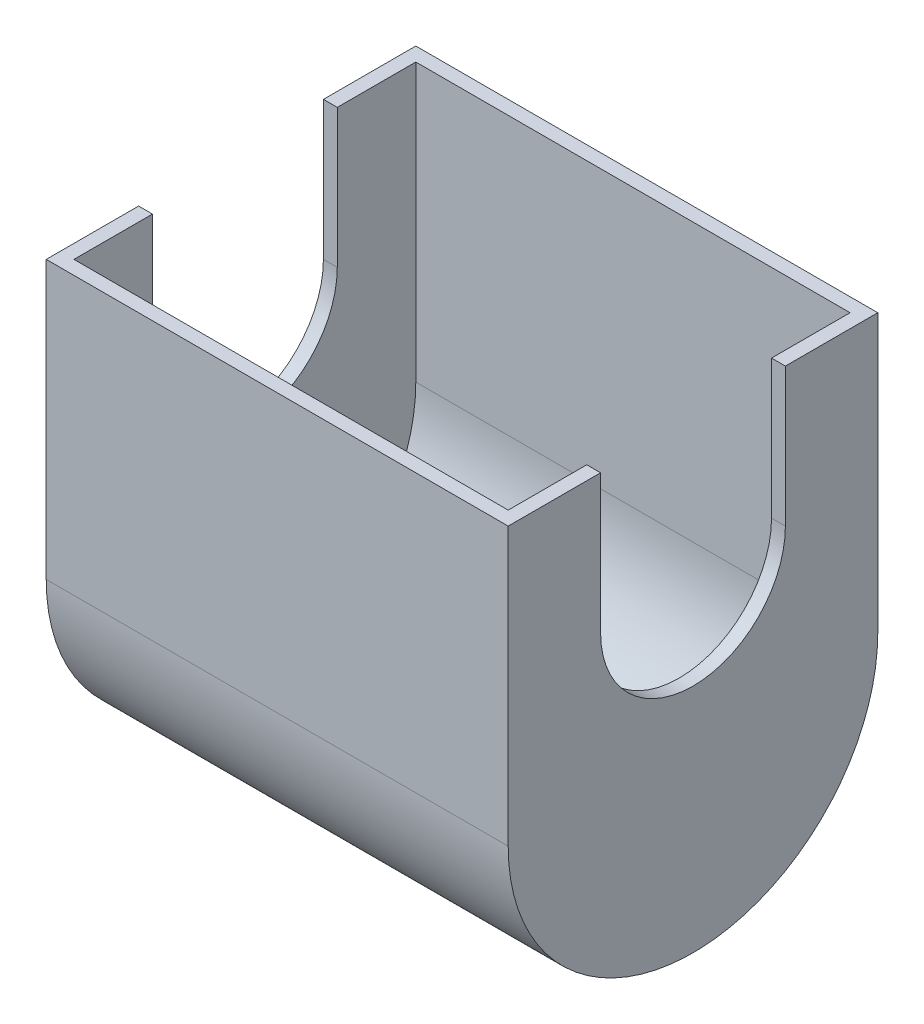
ISO-10303-21;
HEADER;
FILE_DESCRIPTION(('STEP AP214'),'2;1');
FILE_NAME('part.step','',(''),(''),'','','');
FILE_SCHEMA(('AUTOMOTIVE_DESIGN { 1 0 10303 214 1 1 1 1 }'));
ENDSEC;
DATA;
#1=APPLICATION_CONTEXT('core data for automotive mechanical design processes');
#2=APPLICATION_PROTOCOL_DEFINITION('international standard','automotive_design',2000,#1);
#3=PRODUCT_CONTEXT('',#1,'mechanical');
#4=PRODUCT('Part','Part','',(#3));
#5=PRODUCT_RELATED_PRODUCT_CATEGORY('part','',(#4));
#6=PRODUCT_DEFINITION_FORMATION('','',#4);
#7=PRODUCT_DEFINITION_CONTEXT('part definition',#1,'design');
#8=PRODUCT_DEFINITION('design','',#6,#7);
#9=PRODUCT_DEFINITION_SHAPE('','',#8);
#10=(LENGTH_UNIT() NAMED_UNIT(*) SI_UNIT(.MILLI.,.METRE.));
#11=(NAMED_UNIT(*) PLANE_ANGLE_UNIT() SI_UNIT($,.RADIAN.));
#12=(NAMED_UNIT(*) SI_UNIT($,.STERADIAN.) SOLID_ANGLE_UNIT());
#13=UNCERTAINTY_MEASURE_WITH_UNIT(LENGTH_MEASURE(1.E-05),#10,'distance_accuracy_value','');
#14=(GEOMETRIC_REPRESENTATION_CONTEXT(3) GLOBAL_UNCERTAINTY_ASSIGNED_CONTEXT((#13)) GLOBAL_UNIT_ASSIGNED_CONTEXT((#10,
#11,#12)) REPRESENTATION_CONTEXT('',''));
#15=CARTESIAN_POINT('',(0.,0.,0.));
#16=DIRECTION('',(0.,0.,1.));
#17=DIRECTION('',(1.,0.,0.));
#18=AXIS2_PLACEMENT_3D('',#15,#16,#17);
#19=CARTESIAN_POINT('',(100.,0.,40.));
#20=DIRECTION('',(0.,1.,0.));
#21=DIRECTION('',(0.,0.,1.));
#22=AXIS2_PLACEMENT_3D('',#19,#20,#21);
#23=PLANE('',#22);
#24=DIRECTION('',(-1.,0.,0.));
#25=VECTOR('',#24,1.);
#26=CARTESIAN_POINT('',(100.,0.,37.));
#27=LINE('',#26,#25);
#28=CARTESIAN_POINT('',(97.,0.,37.));
#29=VERTEX_POINT('',#28);
#30=CARTESIAN_POINT('',(3.,0.,37.));
#31=VERTEX_POINT('',#30);
#32=EDGE_CURVE('E153',#29,#31,#27,.T.);
#33=ORIENTED_EDGE('',*,*,#32,.T.);
#34=DIRECTION('',(0.,0.,-1.));
#35=VECTOR('',#34,1.);
#36=CARTESIAN_POINT('',(3.,0.,40.));
#37=LINE('',#36,#35);
#38=CARTESIAN_POINT('',(3.,0.,20.));
#39=VERTEX_POINT('',#38);
#40=EDGE_CURVE('E194',#31,#39,#37,.T.);
#41=ORIENTED_EDGE('',*,*,#40,.T.);
#42=DIRECTION('',(-1.,0.,0.));
#43=VECTOR('',#42,1.);
#44=CARTESIAN_POINT('',(100.,0.,20.));
#45=LINE('',#44,#43);
#46=CARTESIAN_POINT('',(0.,0.,20.));
#47=VERTEX_POINT('',#46);
#48=EDGE_CURVE('E148',#39,#47,#45,.T.);
#49=ORIENTED_EDGE('',*,*,#48,.T.);
#50=DIRECTION('',(0.,0.,-1.));
#51=VECTOR('',#50,1.);
#52=CARTESIAN_POINT('',(0.,0.,40.));
#53=LINE('',#52,#51);
#54=CARTESIAN_POINT('',(0.,0.,40.));
#55=VERTEX_POINT('',#54);
#56=EDGE_CURVE('E149',#55,#47,#53,.T.);
#57=ORIENTED_EDGE('',*,*,#56,.F.);
#58=DIRECTION('',(-1.,0.,0.));
#59=VECTOR('',#58,1.);
#60=CARTESIAN_POINT('',(100.,0.,40.));
#61=LINE('',#60,#59);
#62=CARTESIAN_POINT('',(100.,0.,40.));
#63=VERTEX_POINT('',#62);
#64=EDGE_CURVE('E11',#63,#55,#61,.T.);
#65=ORIENTED_EDGE('',*,*,#64,.F.);
#66=DIRECTION('',(0.,0.,-1.));
#67=VECTOR('',#66,1.);
#68=CARTESIAN_POINT('',(100.,0.,40.));
#69=LINE('',#68,#67);
#70=CARTESIAN_POINT('',(100.,0.,20.));
#71=VERTEX_POINT('',#70);
#72=EDGE_CURVE('E169',#63,#71,#69,.T.);
#73=ORIENTED_EDGE('',*,*,#72,.T.);
#74=CARTESIAN_POINT('',(97.,0.,20.));
#75=VERTEX_POINT('',#74);
#76=EDGE_CURVE('E40',#71,#75,#45,.T.);
#77=ORIENTED_EDGE('',*,*,#76,.T.);
#78=DIRECTION('',(0.,0.,-1.));
#79=VECTOR('',#78,1.);
#80=CARTESIAN_POINT('',(97.,0.,40.));
#81=LINE('',#80,#79);
#82=EDGE_CURVE('E53',#29,#75,#81,.T.);
#83=ORIENTED_EDGE('',*,*,#82,.F.);
#84=EDGE_LOOP('',(#33,#41,#49,#57,#65,#73,#77,#83));
#85=FACE_BOUND('',#84,.T.);
#86=ADVANCED_FACE('F37',(#85),#23,.T.);
#87=CARTESIAN_POINT('',(100.,0.,-20.));
#88=DIRECTION('',(0.,1.,0.));
#89=DIRECTION('',(0.,0.,1.));
#90=AXIS2_PLACEMENT_3D('',#87,#88,#89);
#91=PLANE('',#90);
#92=DIRECTION('',(-1.,0.,0.));
#93=VECTOR('',#92,1.);
#94=CARTESIAN_POINT('',(100.,0.,-20.));
#95=LINE('',#94,#93);
#96=CARTESIAN_POINT('',(3.,0.,-20.));
#97=VERTEX_POINT('',#96);
#98=CARTESIAN_POINT('',(0.,0.,-20.));
#99=VERTEX_POINT('',#98);
#100=EDGE_CURVE('E176',#97,#99,#95,.T.);
#101=ORIENTED_EDGE('',*,*,#100,.F.);
#102=DIRECTION('',(0.,0.,-1.));
#103=VECTOR('',#102,1.);
#104=CARTESIAN_POINT('',(3.,0.,-20.));
#105=LINE('',#104,#103);
#106=CARTESIAN_POINT('',(3.,0.,-37.));
#107=VERTEX_POINT('',#106);
#108=EDGE_CURVE('E237',#97,#107,#105,.T.);
#109=ORIENTED_EDGE('',*,*,#108,.T.);
#110=DIRECTION('',(-1.,0.,0.));
#111=VECTOR('',#110,1.);
#112=CARTESIAN_POINT('',(100.,0.,-37.));
#113=LINE('',#112,#111);
#114=CARTESIAN_POINT('',(97.,0.,-37.));
#115=VERTEX_POINT('',#114);
#116=EDGE_CURVE('E232',#115,#107,#113,.T.);
#117=ORIENTED_EDGE('',*,*,#116,.F.);
#118=DIRECTION('',(0.,0.,-1.));
#119=VECTOR('',#118,1.);
#120=CARTESIAN_POINT('',(97.,0.,-20.));
#121=LINE('',#120,#119);
#122=CARTESIAN_POINT('',(97.,0.,-20.));
#123=VERTEX_POINT('',#122);
#124=EDGE_CURVE('E224',#123,#115,#121,.T.);
#125=ORIENTED_EDGE('',*,*,#124,.F.);
#126=CARTESIAN_POINT('',(100.,0.,-20.));
#127=VERTEX_POINT('',#126);
#128=EDGE_CURVE('E173',#127,#123,#95,.T.);
#129=ORIENTED_EDGE('',*,*,#128,.F.);
#130=DIRECTION('',(0.,0.,-1.));
#131=VECTOR('',#130,1.);
#132=CARTESIAN_POINT('',(100.,0.,-20.));
#133=LINE('',#132,#131);
#134=CARTESIAN_POINT('',(100.,0.,-40.));
#135=VERTEX_POINT('',#134);
#136=EDGE_CURVE('E141',#127,#135,#133,.T.);
#137=ORIENTED_EDGE('',*,*,#136,.T.);
#138=DIRECTION('',(-1.,0.,0.));
#139=VECTOR('',#138,1.);
#140=CARTESIAN_POINT('',(100.,0.,-40.));
#141=LINE('',#140,#139);
#142=CARTESIAN_POINT('',(0.,0.,-40.));
#143=VERTEX_POINT('',#142);
#144=EDGE_CURVE('E138',#135,#143,#141,.T.);
#145=ORIENTED_EDGE('',*,*,#144,.T.);
#146=DIRECTION('',(0.,0.,-1.));
#147=VECTOR('',#146,1.);
#148=CARTESIAN_POINT('',(0.,0.,-20.));
#149=LINE('',#148,#147);
#150=EDGE_CURVE('E162',#99,#143,#149,.T.);
#151=ORIENTED_EDGE('',*,*,#150,.F.);
#152=EDGE_LOOP('',(#101,#109,#117,#125,#129,#137,#145,#151));
#153=FACE_BOUND('',#152,.T.);
#154=ADVANCED_FACE('F261',(#153),#91,.T.);
#155=CARTESIAN_POINT('',(100.,0.,-20.));
#156=DIRECTION('',(0.,0.,-1.));
#157=DIRECTION('',(0.,1.,0.));
#158=AXIS2_PLACEMENT_3D('',#155,#156,#157);
#159=PLANE('',#158);
#160=DIRECTION('',(0.,-1.,0.));
#161=VECTOR('',#160,1.);
#162=CARTESIAN_POINT('',(3.,0.,-20.));
#163=LINE('',#162,#161);
#164=CARTESIAN_POINT('',(3.,-30.,-20.));
#165=VERTEX_POINT('',#164);
#166=EDGE_CURVE('E241',#97,#165,#163,.T.);
#167=ORIENTED_EDGE('',*,*,#166,.F.);
#168=ORIENTED_EDGE('',*,*,#100,.T.);
#169=DIRECTION('',(0.,-1.,0.));
#170=VECTOR('',#169,1.);
#171=CARTESIAN_POINT('',(0.,0.,-20.));
#172=LINE('',#171,#170);
#173=CARTESIAN_POINT('',(0.,-30.,-20.));
#174=VERTEX_POINT('',#173);
#175=EDGE_CURVE('E159',#99,#174,#172,.T.);
#176=ORIENTED_EDGE('',*,*,#175,.T.);
#177=DIRECTION('',(-1.,0.,0.));
#178=VECTOR('',#177,1.);
#179=CARTESIAN_POINT('',(100.,-30.,-20.));
#180=LINE('',#179,#178);
#181=EDGE_CURVE('E179',#165,#174,#180,.T.);
#182=ORIENTED_EDGE('',*,*,#181,.F.);
#183=EDGE_LOOP('',(#167,#168,#176,#182));
#184=FACE_BOUND('',#183,.T.);
#185=ADVANCED_FACE('F281',(#184),#159,.F.);
#186=CARTESIAN_POINT('',(100.,-30.,0.));
#187=DIRECTION('',(-1.,0.,0.));
#188=DIRECTION('',(0.,0.,1.));
#189=AXIS2_PLACEMENT_3D('',#186,#187,#188);
#190=CYLINDRICAL_SURFACE('',#189,20.);
#191=DIRECTION('',(-1.,0.,0.));
#192=VECTOR('',#191,1.);
#193=CARTESIAN_POINT('',(100.,-30.,20.));
#194=LINE('',#193,#192);
#195=CARTESIAN_POINT('',(3.,-30.,20.));
#196=VERTEX_POINT('',#195);
#197=CARTESIAN_POINT('',(0.,-30.,20.));
#198=VERTEX_POINT('',#197);
#199=EDGE_CURVE('E182',#196,#198,#194,.T.);
#200=ORIENTED_EDGE('',*,*,#199,.F.);
#201=CARTESIAN_POINT('',(3.,-30.,0.));
#202=DIRECTION('',(1.,0.,0.));
#203=DIRECTION('',(0.,0.,-1.));
#204=AXIS2_PLACEMENT_3D('',#201,#202,#203);
#205=CIRCLE('',#204,20.);
#206=EDGE_CURVE('E244',#196,#165,#205,.T.);
#207=ORIENTED_EDGE('',*,*,#206,.T.);
#208=ORIENTED_EDGE('',*,*,#181,.T.);
#209=CARTESIAN_POINT('',(0.,-30.,0.));
#210=DIRECTION('',(1.,0.,0.));
#211=DIRECTION('',(0.,0.,-1.));
#212=AXIS2_PLACEMENT_3D('',#209,#210,#211);
#213=CIRCLE('',#212,20.);
#214=EDGE_CURVE('E156',#198,#174,#213,.T.);
#215=ORIENTED_EDGE('',*,*,#214,.F.);
#216=EDGE_LOOP('',(#200,#207,#208,#215));
#217=FACE_BOUND('',#216,.T.);
#218=ADVANCED_FACE('F254',(#217),#190,.F.);
#219=CARTESIAN_POINT('',(100.,0.,20.));
#220=DIRECTION('',(0.,0.,-1.));
#221=DIRECTION('',(0.,1.,0.));
#222=AXIS2_PLACEMENT_3D('',#219,#220,#221);
#223=PLANE('',#222);
#224=ORIENTED_EDGE('',*,*,#48,.F.);
#225=DIRECTION('',(0.,-1.,0.));
#226=VECTOR('',#225,1.);
#227=CARTESIAN_POINT('',(3.,0.,20.));
#228=LINE('',#227,#226);
#229=EDGE_CURVE('E246',#39,#196,#228,.T.);
#230=ORIENTED_EDGE('',*,*,#229,.T.);
#231=ORIENTED_EDGE('',*,*,#199,.T.);
#232=DIRECTION('',(0.,-1.,0.));
#233=VECTOR('',#232,1.);
#234=CARTESIAN_POINT('',(0.,0.,20.));
#235=LINE('',#234,#233);
#236=EDGE_CURVE('E152',#47,#198,#235,.T.);
#237=ORIENTED_EDGE('',*,*,#236,.F.);
#238=EDGE_LOOP('',(#224,#230,#231,#237));
#239=FACE_BOUND('',#238,.T.);
#240=ADVANCED_FACE('F195',(#239),#223,.T.);
#241=CARTESIAN_POINT('',(100.,0.,40.));
#242=DIRECTION('',(0.,0.,-1.));
#243=DIRECTION('',(-1.,0.,0.));
#244=AXIS2_PLACEMENT_3D('',#241,#242,#243);
#245=PLANE('',#244);
#246=DIRECTION('',(0.,-1.,0.));
#247=VECTOR('',#246,1.);
#248=CARTESIAN_POINT('',(0.,0.,40.));
#249=LINE('',#248,#247);
#250=CARTESIAN_POINT('',(0.,-60.,40.));
#251=VERTEX_POINT('',#250);
#252=EDGE_CURVE('E168',#55,#251,#249,.T.);
#253=ORIENTED_EDGE('',*,*,#252,.T.);
#254=DIRECTION('',(-1.,0.,0.));
#255=VECTOR('',#254,1.);
#256=CARTESIAN_POINT('',(100.,-60.,40.));
#257=LINE('',#256,#255);
#258=CARTESIAN_POINT('',(100.,-60.,40.));
#259=VERTEX_POINT('',#258);
#260=EDGE_CURVE('E45',#259,#251,#257,.T.);
#261=ORIENTED_EDGE('',*,*,#260,.F.);
#262=DIRECTION('',(0.,-1.,0.));
#263=VECTOR('',#262,1.);
#264=CARTESIAN_POINT('',(100.,0.,40.));
#265=LINE('',#264,#263);
#266=EDGE_CURVE('E125',#63,#259,#265,.T.);
#267=ORIENTED_EDGE('',*,*,#266,.F.);
#268=ORIENTED_EDGE('',*,*,#64,.T.);
#269=EDGE_LOOP('',(#253,#261,#267,#268));
#270=FACE_BOUND('',#269,.T.);
#271=ADVANCED_FACE('F198',(#270),#245,.F.);
#272=CARTESIAN_POINT('',(100.,-60.,0.));
#273=DIRECTION('',(-1.,0.,0.));
#274=DIRECTION('',(0.,0.,1.));
#275=AXIS2_PLACEMENT_3D('',#272,#273,#274);
#276=CYLINDRICAL_SURFACE('',#275,40.);
#277=CARTESIAN_POINT('',(0.,-60.,0.));
#278=DIRECTION('',(1.,0.,0.));
#279=DIRECTION('',(0.,0.,-1.));
#280=AXIS2_PLACEMENT_3D('',#277,#278,#279);
#281=CIRCLE('',#280,40.);
#282=CARTESIAN_POINT('',(0.,-60.,-40.));
#283=VERTEX_POINT('',#282);
#284=EDGE_CURVE('E134',#251,#283,#281,.T.);
#285=ORIENTED_EDGE('',*,*,#284,.T.);
#286=DIRECTION('',(-1.,0.,0.));
#287=VECTOR('',#286,1.);
#288=CARTESIAN_POINT('',(100.,-60.,-40.));
#289=LINE('',#288,#287);
#290=CARTESIAN_POINT('',(100.,-60.,-40.));
#291=VERTEX_POINT('',#290);
#292=EDGE_CURVE('E131',#291,#283,#289,.T.);
#293=ORIENTED_EDGE('',*,*,#292,.F.);
#294=CARTESIAN_POINT('',(100.,-60.,0.));
#295=DIRECTION('',(1.,0.,0.));
#296=DIRECTION('',(0.,0.,-1.));
#297=AXIS2_PLACEMENT_3D('',#294,#295,#296);
#298=CIRCLE('',#297,40.);
#299=EDGE_CURVE('E117',#259,#291,#298,.T.);
#300=ORIENTED_EDGE('',*,*,#299,.F.);
#301=ORIENTED_EDGE('',*,*,#260,.T.);
#302=EDGE_LOOP('',(#285,#293,#300,#301));
#303=FACE_BOUND('',#302,.T.);
#304=ADVANCED_FACE('F132',(#303),#276,.T.);
#305=CARTESIAN_POINT('',(100.,0.,-40.));
#306=DIRECTION('',(0.,0.,-1.));
#307=DIRECTION('',(0.,1.,0.));
#308=AXIS2_PLACEMENT_3D('',#305,#306,#307);
#309=PLANE('',#308);
#310=DIRECTION('',(0.,-1.,0.));
#311=VECTOR('',#310,1.);
#312=CARTESIAN_POINT('',(0.,0.,-40.));
#313=LINE('',#312,#311);
#314=EDGE_CURVE('E165',#143,#283,#313,.T.);
#315=ORIENTED_EDGE('',*,*,#314,.F.);
#316=ORIENTED_EDGE('',*,*,#144,.F.);
#317=DIRECTION('',(0.,-1.,0.));
#318=VECTOR('',#317,1.);
#319=CARTESIAN_POINT('',(100.,0.,-40.));
#320=LINE('',#319,#318);
#321=EDGE_CURVE('E123',#135,#291,#320,.T.);
#322=ORIENTED_EDGE('',*,*,#321,.T.);
#323=ORIENTED_EDGE('',*,*,#292,.T.);
#324=EDGE_LOOP('',(#315,#316,#322,#323));
#325=FACE_BOUND('',#324,.T.);
#326=ADVANCED_FACE('F140',(#325),#309,.T.);
#327=ORIENTED_EDGE('',*,*,#128,.T.);
#328=DIRECTION('',(0.,-1.,0.));
#329=VECTOR('',#328,1.);
#330=CARTESIAN_POINT('',(97.,0.,-20.));
#331=LINE('',#330,#329);
#332=CARTESIAN_POINT('',(97.,-30.,-20.));
#333=VERTEX_POINT('',#332);
#334=EDGE_CURVE('E215',#123,#333,#331,.T.);
#335=ORIENTED_EDGE('',*,*,#334,.T.);
#336=CARTESIAN_POINT('',(100.,-30.,-20.));
#337=VERTEX_POINT('',#336);
#338=EDGE_CURVE('E177',#337,#333,#180,.T.);
#339=ORIENTED_EDGE('',*,*,#338,.F.);
#340=DIRECTION('',(0.,-1.,0.));
#341=VECTOR('',#340,1.);
#342=CARTESIAN_POINT('',(100.,0.,-20.));
#343=LINE('',#342,#341);
#344=EDGE_CURVE('E143',#127,#337,#343,.T.);
#345=ORIENTED_EDGE('',*,*,#344,.F.);
#346=EDGE_LOOP('',(#327,#335,#339,#345));
#347=FACE_BOUND('',#346,.T.);
#348=ADVANCED_FACE('F212',(#347),#159,.F.);
#349=CARTESIAN_POINT('',(97.,-30.,0.));
#350=DIRECTION('',(1.,0.,0.));
#351=DIRECTION('',(0.,0.,-1.));
#352=AXIS2_PLACEMENT_3D('',#349,#350,#351);
#353=CIRCLE('',#352,20.);
#354=CARTESIAN_POINT('',(97.,-30.,20.));
#355=VERTEX_POINT('',#354);
#356=EDGE_CURVE('E220',#355,#333,#353,.T.);
#357=ORIENTED_EDGE('',*,*,#356,.F.);
#358=CARTESIAN_POINT('',(100.,-30.,20.));
#359=VERTEX_POINT('',#358);
#360=EDGE_CURVE('E180',#359,#355,#194,.T.);
#361=ORIENTED_EDGE('',*,*,#360,.F.);
#362=CARTESIAN_POINT('',(100.,-30.,0.));
#363=DIRECTION('',(1.,0.,0.));
#364=DIRECTION('',(0.,0.,-1.));
#365=AXIS2_PLACEMENT_3D('',#362,#363,#364);
#366=CIRCLE('',#365,20.);
#367=EDGE_CURVE('E202',#359,#337,#366,.T.);
#368=ORIENTED_EDGE('',*,*,#367,.T.);
#369=ORIENTED_EDGE('',*,*,#338,.T.);
#370=EDGE_LOOP('',(#357,#361,#368,#369));
#371=FACE_BOUND('',#370,.T.);
#372=ADVANCED_FACE('F218',(#371),#190,.F.);
#373=DIRECTION('',(0.,-1.,0.));
#374=VECTOR('',#373,1.);
#375=CARTESIAN_POINT('',(97.,0.,20.));
#376=LINE('',#375,#374);
#377=EDGE_CURVE('E222',#75,#355,#376,.T.);
#378=ORIENTED_EDGE('',*,*,#377,.F.);
#379=ORIENTED_EDGE('',*,*,#76,.F.);
#380=DIRECTION('',(0.,-1.,0.));
#381=VECTOR('',#380,1.);
#382=CARTESIAN_POINT('',(100.,0.,20.));
#383=LINE('',#382,#381);
#384=EDGE_CURVE('E200',#71,#359,#383,.T.);
#385=ORIENTED_EDGE('',*,*,#384,.T.);
#386=ORIENTED_EDGE('',*,*,#360,.T.);
#387=EDGE_LOOP('',(#378,#379,#385,#386));
#388=FACE_BOUND('',#387,.T.);
#389=ADVANCED_FACE('F318',(#388),#223,.T.);
#390=CARTESIAN_POINT('',(100.,-30.,0.));
#391=DIRECTION('',(1.,0.,0.));
#392=DIRECTION('',(0.,0.,-1.));
#393=AXIS2_PLACEMENT_3D('',#390,#391,#392);
#394=PLANE('',#393);
#395=ORIENTED_EDGE('',*,*,#72,.F.);
#396=ORIENTED_EDGE('',*,*,#266,.T.);
#397=ORIENTED_EDGE('',*,*,#299,.T.);
#398=ORIENTED_EDGE('',*,*,#321,.F.);
#399=ORIENTED_EDGE('',*,*,#136,.F.);
#400=ORIENTED_EDGE('',*,*,#344,.T.);
#401=ORIENTED_EDGE('',*,*,#367,.F.);
#402=ORIENTED_EDGE('',*,*,#384,.F.);
#403=EDGE_LOOP('',(#395,#396,#397,#398,#399,#400,#401,#402));
#404=FACE_BOUND('',#403,.T.);
#405=ADVANCED_FACE('F120',(#404),#394,.T.);
#406=CARTESIAN_POINT('',(0.,-30.,0.));
#407=DIRECTION('',(1.,0.,0.));
#408=DIRECTION('',(0.,0.,-1.));
#409=AXIS2_PLACEMENT_3D('',#406,#407,#408);
#410=PLANE('',#409);
#411=ORIENTED_EDGE('',*,*,#56,.T.);
#412=ORIENTED_EDGE('',*,*,#236,.T.);
#413=ORIENTED_EDGE('',*,*,#214,.T.);
#414=ORIENTED_EDGE('',*,*,#175,.F.);
#415=ORIENTED_EDGE('',*,*,#150,.T.);
#416=ORIENTED_EDGE('',*,*,#314,.T.);
#417=ORIENTED_EDGE('',*,*,#284,.F.);
#418=ORIENTED_EDGE('',*,*,#252,.F.);
#419=EDGE_LOOP('',(#411,#412,#413,#414,#415,#416,#417,#418));
#420=FACE_BOUND('',#419,.T.);
#421=ADVANCED_FACE('F197',(#420),#410,.F.);
#422=CARTESIAN_POINT('',(100.,0.,37.));
#423=DIRECTION('',(0.,0.,-1.));
#424=DIRECTION('',(-1.,0.,0.));
#425=AXIS2_PLACEMENT_3D('',#422,#423,#424);
#426=PLANE('',#425);
#427=DIRECTION('',(0.,-1.,0.));
#428=VECTOR('',#427,1.);
#429=CARTESIAN_POINT('',(3.,0.,37.));
#430=LINE('',#429,#428);
#431=CARTESIAN_POINT('',(3.,-60.,37.));
#432=VERTEX_POINT('',#431);
#433=EDGE_CURVE('E436',#31,#432,#430,.T.);
#434=ORIENTED_EDGE('',*,*,#433,.F.);
#435=ORIENTED_EDGE('',*,*,#32,.F.);
#436=DIRECTION('',(0.,-1.,0.));
#437=VECTOR('',#436,1.);
#438=CARTESIAN_POINT('',(97.,0.,37.));
#439=LINE('',#438,#437);
#440=CARTESIAN_POINT('',(97.,-60.,37.));
#441=VERTEX_POINT('',#440);
#442=EDGE_CURVE('E236',#29,#441,#439,.T.);
#443=ORIENTED_EDGE('',*,*,#442,.T.);
#444=DIRECTION('',(-1.,0.,0.));
#445=VECTOR('',#444,1.);
#446=CARTESIAN_POINT('',(100.,-60.,37.));
#447=LINE('',#446,#445);
#448=EDGE_CURVE('E443',#441,#432,#447,.T.);
#449=ORIENTED_EDGE('',*,*,#448,.T.);
#450=EDGE_LOOP('',(#434,#435,#443,#449));
#451=FACE_BOUND('',#450,.T.);
#452=ADVANCED_FACE('F348',(#451),#426,.T.);
#453=CARTESIAN_POINT('',(100.,-60.,0.));
#454=DIRECTION('',(-1.,0.,0.));
#455=DIRECTION('',(0.,0.,1.));
#456=AXIS2_PLACEMENT_3D('',#453,#454,#455);
#457=CYLINDRICAL_SURFACE('',#456,37.);
#458=CARTESIAN_POINT('',(3.,-60.,0.));
#459=DIRECTION('',(1.,0.,0.));
#460=DIRECTION('',(0.,0.,-1.));
#461=AXIS2_PLACEMENT_3D('',#458,#459,#460);
#462=CIRCLE('',#461,37.);
#463=CARTESIAN_POINT('',(3.,-60.,-37.));
#464=VERTEX_POINT('',#463);
#465=EDGE_CURVE('E434',#432,#464,#462,.T.);
#466=ORIENTED_EDGE('',*,*,#465,.F.);
#467=ORIENTED_EDGE('',*,*,#448,.F.);
#468=CARTESIAN_POINT('',(97.,-60.,0.));
#469=DIRECTION('',(1.,0.,0.));
#470=DIRECTION('',(0.,0.,-1.));
#471=AXIS2_PLACEMENT_3D('',#468,#469,#470);
#472=CIRCLE('',#471,37.);
#473=CARTESIAN_POINT('',(97.,-60.,-37.));
#474=VERTEX_POINT('',#473);
#475=EDGE_CURVE('E440',#441,#474,#472,.T.);
#476=ORIENTED_EDGE('',*,*,#475,.T.);
#477=DIRECTION('',(1.,0.,0.));
#478=VECTOR('',#477,1.);
#479=CARTESIAN_POINT('',(100.,-60.,-37.));
#480=LINE('',#479,#478);
#481=EDGE_CURVE('E235',#474,#464,#480,.F.);
#482=ORIENTED_EDGE('',*,*,#481,.T.);
#483=EDGE_LOOP('',(#466,#467,#476,#482));
#484=FACE_BOUND('',#483,.T.);
#485=ADVANCED_FACE('F353',(#484),#457,.F.);
#486=CARTESIAN_POINT('',(100.,0.,-37.));
#487=DIRECTION('',(0.,0.,-1.));
#488=DIRECTION('',(0.,1.,0.));
#489=AXIS2_PLACEMENT_3D('',#486,#487,#488);
#490=PLANE('',#489);
#491=DIRECTION('',(0.,-1.,0.));
#492=VECTOR('',#491,1.);
#493=CARTESIAN_POINT('',(3.,0.,-37.));
#494=LINE('',#493,#492);
#495=EDGE_CURVE('E240',#107,#464,#494,.T.);
#496=ORIENTED_EDGE('',*,*,#495,.T.);
#497=ORIENTED_EDGE('',*,*,#481,.F.);
#498=DIRECTION('',(0.,-1.,0.));
#499=VECTOR('',#498,1.);
#500=CARTESIAN_POINT('',(97.,0.,-37.));
#501=LINE('',#500,#499);
#502=EDGE_CURVE('E231',#115,#474,#501,.T.);
#503=ORIENTED_EDGE('',*,*,#502,.F.);
#504=ORIENTED_EDGE('',*,*,#116,.T.);
#505=EDGE_LOOP('',(#496,#497,#503,#504));
#506=FACE_BOUND('',#505,.T.);
#507=ADVANCED_FACE('F364',(#506),#490,.F.);
#508=CARTESIAN_POINT('',(97.,-30.,0.));
#509=DIRECTION('',(1.,0.,0.));
#510=DIRECTION('',(0.,0.,-1.));
#511=AXIS2_PLACEMENT_3D('',#508,#509,#510);
#512=PLANE('',#511);
#513=ORIENTED_EDGE('',*,*,#82,.T.);
#514=ORIENTED_EDGE('',*,*,#377,.T.);
#515=ORIENTED_EDGE('',*,*,#356,.T.);
#516=ORIENTED_EDGE('',*,*,#334,.F.);
#517=ORIENTED_EDGE('',*,*,#124,.T.);
#518=ORIENTED_EDGE('',*,*,#502,.T.);
#519=ORIENTED_EDGE('',*,*,#475,.F.);
#520=ORIENTED_EDGE('',*,*,#442,.F.);
#521=EDGE_LOOP('',(#513,#514,#515,#516,#517,#518,#519,#520));
#522=FACE_BOUND('',#521,.T.);
#523=ADVANCED_FACE('F374',(#522),#512,.F.);
#524=CARTESIAN_POINT('',(3.,-30.,0.));
#525=DIRECTION('',(1.,0.,0.));
#526=DIRECTION('',(0.,0.,-1.));
#527=AXIS2_PLACEMENT_3D('',#524,#525,#526);
#528=PLANE('',#527);
#529=ORIENTED_EDGE('',*,*,#40,.F.);
#530=ORIENTED_EDGE('',*,*,#433,.T.);
#531=ORIENTED_EDGE('',*,*,#465,.T.);
#532=ORIENTED_EDGE('',*,*,#495,.F.);
#533=ORIENTED_EDGE('',*,*,#108,.F.);
#534=ORIENTED_EDGE('',*,*,#166,.T.);
#535=ORIENTED_EDGE('',*,*,#206,.F.);
#536=ORIENTED_EDGE('',*,*,#229,.F.);
#537=EDGE_LOOP('',(#529,#530,#531,#532,#533,#534,#535,#536));
#538=FACE_BOUND('',#537,.T.);
#539=ADVANCED_FACE('F279',(#538),#528,.T.);
#540=CLOSED_SHELL('',(#86,#154,#185,#218,#240,#271,#304,#326,#348,#372,#389,#405,#421,#452,#485,
#507,#523,#539));
#541=MANIFOLD_SOLID_BREP('B2',#540);
#542=ADVANCED_BREP_SHAPE_REPRESENTATION('',(#18,#541),#14);
#543=SHAPE_DEFINITION_REPRESENTATION(#9,#542);
ENDSEC;
END-ISO-10303-21;
